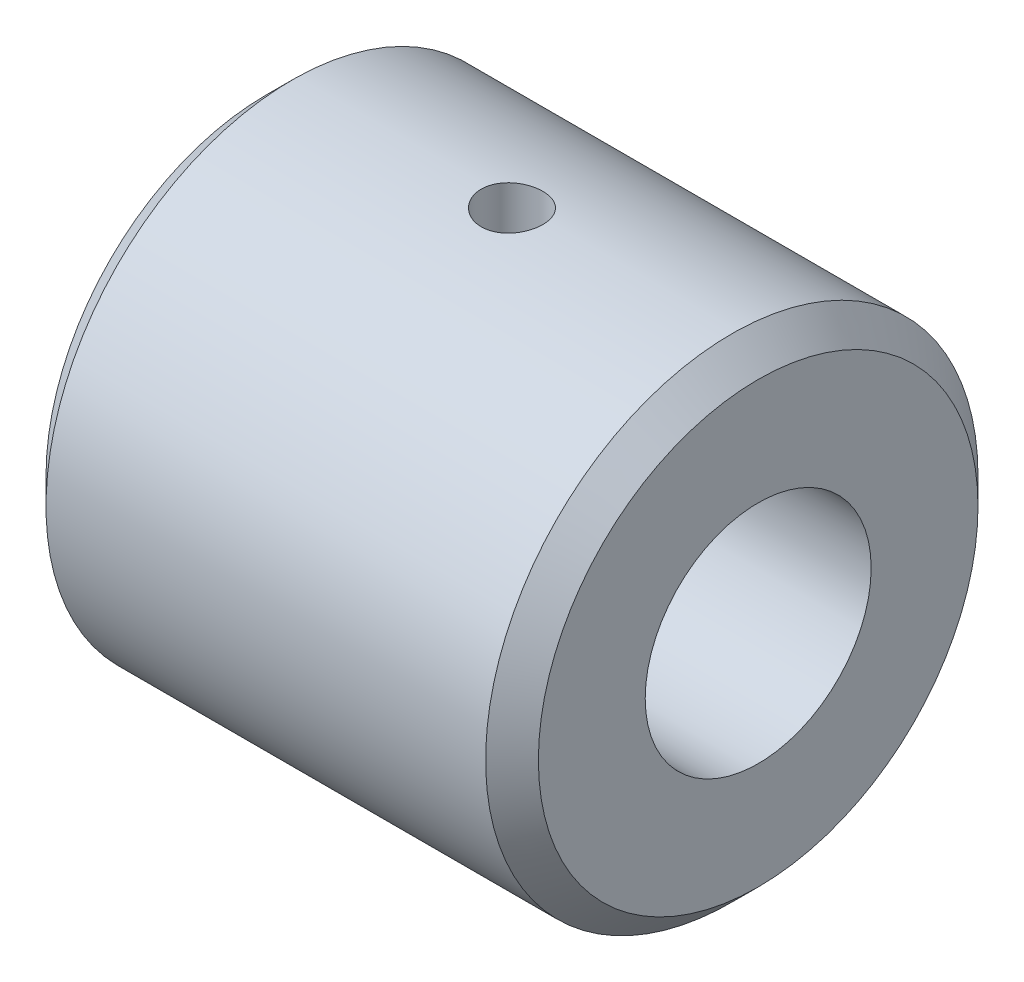
ISO-10303-21;
HEADER;
FILE_DESCRIPTION(('STEP AP214'),'2;1');
FILE_NAME('part.step','',(''),(''),'','','');
FILE_SCHEMA(('AUTOMOTIVE_DESIGN { 1 0 10303 214 1 1 1 1 }'));
ENDSEC;
DATA;
#1=APPLICATION_CONTEXT('core data for automotive mechanical design processes');
#2=APPLICATION_PROTOCOL_DEFINITION('international standard','automotive_design',2000,#1);
#3=PRODUCT_CONTEXT('',#1,'mechanical');
#4=PRODUCT('Part','Part','',(#3));
#5=PRODUCT_RELATED_PRODUCT_CATEGORY('part','',(#4));
#6=PRODUCT_DEFINITION_FORMATION('','',#4);
#7=PRODUCT_DEFINITION_CONTEXT('part definition',#1,'design');
#8=PRODUCT_DEFINITION('design','',#6,#7);
#9=PRODUCT_DEFINITION_SHAPE('','',#8);
#10=(LENGTH_UNIT() NAMED_UNIT(*) SI_UNIT(.MILLI.,.METRE.));
#11=(NAMED_UNIT(*) PLANE_ANGLE_UNIT() SI_UNIT($,.RADIAN.));
#12=(NAMED_UNIT(*) SI_UNIT($,.STERADIAN.) SOLID_ANGLE_UNIT());
#13=UNCERTAINTY_MEASURE_WITH_UNIT(LENGTH_MEASURE(1.E-05),#10,'distance_accuracy_value','');
#14=(GEOMETRIC_REPRESENTATION_CONTEXT(3) GLOBAL_UNCERTAINTY_ASSIGNED_CONTEXT((#13)) GLOBAL_UNIT_ASSIGNED_CONTEXT((#10,
#11,#12)) REPRESENTATION_CONTEXT('',''));
#15=CARTESIAN_POINT('',(0.,0.,0.));
#16=DIRECTION('',(0.,0.,1.));
#17=DIRECTION('',(1.,0.,0.));
#18=AXIS2_PLACEMENT_3D('',#15,#16,#17);
#19=CARTESIAN_POINT('',(3.556,0.,0.));
#20=DIRECTION('',(-1.,0.,0.));
#21=DIRECTION('',(0.,0.,1.));
#22=AXIS2_PLACEMENT_3D('',#19,#20,#21);
#23=CYLINDRICAL_SURFACE('',#22,3.556);
#24=CARTESIAN_POINT('',(-0.444499999999994,-3.556,0.));
#25=CARTESIAN_POINT('',(-0.444498943701623,-3.55599965310585,0.024863746789814));
#26=CARTESIAN_POINT('',(-0.442406782083695,-3.55573647293861,0.0497430303110277));
#27=CARTESIAN_POINT('',(-0.434093765237306,-3.554711910318,0.0988092922115566));
#28=CARTESIAN_POINT('',(-0.427868599037215,-3.55395000767886,0.1229955201849));
#29=CARTESIAN_POINT('',(-0.41147584691207,-3.55201383253695,0.169958233201759));
#30=CARTESIAN_POINT('',(-0.401310914606202,-3.55083983764795,0.19273565519398));
#31=CARTESIAN_POINT('',(-0.377332976910165,-3.54821005016126,0.236256990635978));
#32=CARTESIAN_POINT('',(-0.363520597323233,-3.54675430591556,0.257001252084719));
#33=CARTESIAN_POINT('',(-0.332558551318516,-3.54371459128265,0.295985938850384));
#34=CARTESIAN_POINT('',(-0.315392818402234,-3.54213002592312,0.314213558885816));
#35=CARTESIAN_POINT('',(-0.278245829975181,-3.53901605684534,0.347537266694517));
#36=CARTESIAN_POINT('',(-0.258264431034421,-3.53748665594215,0.362633194842537));
#37=CARTESIAN_POINT('',(-0.215970107988822,-3.53465031939162,0.389312686676279));
#38=CARTESIAN_POINT('',(-0.193649561113217,-3.53334415002233,0.400884254658317));
#39=CARTESIAN_POINT('',(-0.147362942163757,-3.53111000639776,0.42010994301505));
#40=CARTESIAN_POINT('',(-0.123396932529259,-3.53018201780116,0.427764211943989));
#41=CARTESIAN_POINT('',(-0.0746325820246721,-3.52881498381523,0.438899118648397));
#42=CARTESIAN_POINT('',(-0.0498392499801937,-3.52837340655053,0.44240137587929));
#43=CARTESIAN_POINT('',(-1.31103547080831E-05,-3.52802144203788,0.445199740711269));
#44=CARTESIAN_POINT('',(0.0250196875556231,-3.52811103342868,0.444496017458223));
#45=CARTESIAN_POINT('',(0.0744634982848323,-3.52880896664742,0.438920144640431));
#46=CARTESIAN_POINT('',(0.0988772445464053,-3.52941434469346,0.434071810058673));
#47=CARTESIAN_POINT('',(0.146541874772734,-3.53107101716906,0.420381498129763));
#48=CARTESIAN_POINT('',(0.169792735166154,-3.5321223206333,0.411539439867482));
#49=CARTESIAN_POINT('',(0.214545570226053,-3.53455574800735,0.390087076552286));
#50=CARTESIAN_POINT('',(0.236042532784266,-3.53593877836995,0.377466422509212));
#51=CARTESIAN_POINT('',(0.276622430266671,-3.5388791249236,0.348822525269435));
#52=CARTESIAN_POINT('',(0.295705254710116,-3.54043644908491,0.332799126439157));
#53=CARTESIAN_POINT('',(0.331053413966499,-3.54356308538518,0.297672601892018));
#54=CARTESIAN_POINT('',(0.347298356515986,-3.54513240596389,0.27854894899395));
#55=CARTESIAN_POINT('',(0.376350838869426,-3.54809613668431,0.237835444668452));
#56=CARTESIAN_POINT('',(0.389158370747076,-3.54949054642268,0.216245587554382));
#57=CARTESIAN_POINT('',(0.410972488778478,-3.55194820864463,0.171196805168424));
#58=CARTESIAN_POINT('',(0.419977798020076,-3.55301134984593,0.147737255131044));
#59=CARTESIAN_POINT('',(0.433915653748428,-3.55468567711695,0.0996227518086404));
#60=CARTESIAN_POINT('',(0.438848390905961,-3.5552968843453,0.0749678545449316));
#61=CARTESIAN_POINT('',(0.44447465003352,-3.55599572641833,0.0253388405438195));
#62=CARTESIAN_POINT('',(0.445196263442325,-3.5560868306616,0.000367955357312362));
#63=CARTESIAN_POINT('',(0.442453924884846,-3.55574456897365,-0.049338795289254));
#64=CARTESIAN_POINT('',(0.438990062054661,-3.55531121421158,-0.0740746657430037));
#65=CARTESIAN_POINT('',(0.427998433779908,-3.5539708908494,-0.122526337472885));
#66=CARTESIAN_POINT('',(0.420484062667006,-3.55306548356706,-0.14624522422151));
#67=CARTESIAN_POINT('',(0.401618649049877,-3.55088242367215,-0.192086168633822));
#68=CARTESIAN_POINT('',(0.390267476272219,-3.54960475842027,-0.21420817204653));
#69=CARTESIAN_POINT('',(0.363982712151169,-3.54681098113418,-0.256352843778221));
#70=CARTESIAN_POINT('',(0.349030949672553,-3.54529367350758,-0.276364098518007));
#71=CARTESIAN_POINT('',(0.315995139338414,-3.54219408305502,-0.313603104755555));
#72=CARTESIAN_POINT('',(0.29791096714977,-3.54061179765183,-0.330830745712289));
#73=CARTESIAN_POINT('',(0.258999941300577,-3.53754988151247,-0.362113162277838));
#74=CARTESIAN_POINT('',(0.238158060026009,-3.53607088645452,-0.376149316888973));
#75=CARTESIAN_POINT('',(0.19439616406483,-3.53339346082405,-0.400521683743049));
#76=CARTESIAN_POINT('',(0.171476191049073,-3.53219502462737,-0.410857970156898));
#77=CARTESIAN_POINT('',(0.124268808255553,-3.53021873399875,-0.427507045722465));
#78=CARTESIAN_POINT('',(0.0999851490174692,-3.52943978293855,-0.433830333561868));
#79=CARTESIAN_POINT('',(0.0506903383837968,-3.52838751048345,-0.442307724909697));
#80=CARTESIAN_POINT('',(0.0256792208864892,-3.52811416556641,-0.444462022370852));
#81=CARTESIAN_POINT('',(-0.0241752756125915,-3.52810473927481,-0.444536722115878));
#82=CARTESIAN_POINT('',(-0.049018615153409,-3.52836494560897,-0.442486379030925));
#83=CARTESIAN_POINT('',(-0.0980046275975534,-3.52938532164714,-0.434271949182204));
#84=CARTESIAN_POINT('',(-0.122147300425802,-3.53014549140472,-0.42810786197764));
#85=CARTESIAN_POINT('',(-0.169042808913063,-3.53207899384715,-0.411850065702015));
#86=CARTESIAN_POINT('',(-0.191796139524876,-3.53325217837597,-0.401757765616626));
#87=CARTESIAN_POINT('',(-0.235291035089787,-3.53587976660929,-0.37793290720232));
#88=CARTESIAN_POINT('',(-0.256032574830922,-3.53733417383741,-0.3642003032608));
#89=CARTESIAN_POINT('',(-0.295064651865532,-3.54037245524947,-0.333376125699061));
#90=CARTESIAN_POINT('',(-0.313337910957791,-3.54195712856541,-0.316262750262783));
#91=CARTESIAN_POINT('',(-0.346764553514861,-3.54507033457218,-0.279208270354974));
#92=CARTESIAN_POINT('',(-0.361917200355668,-3.546598853938,-0.259266500109367));
#93=CARTESIAN_POINT('',(-0.388721536493316,-3.54943394661123,-0.217034347387875));
#94=CARTESIAN_POINT('',(-0.400359693088882,-3.55073965378922,-0.194735321912196));
#95=CARTESIAN_POINT('',(-0.419709566990509,-3.55297322005842,-0.148495520029165));
#96=CARTESIAN_POINT('',(-0.427425550645639,-3.5539014894871,-0.124556559778726));
#97=CARTESIAN_POINT('',(-0.436865150326852,-3.55505182874273,-0.0837448262558958));
#98=CARTESIAN_POINT('',(-0.439724103884405,-3.55540566064212,-0.0671293969733075));
#99=CARTESIAN_POINT('',(-0.443541879484249,-3.5558798629033,-0.0336783538391704));
#100=CARTESIAN_POINT('',(-0.44450071553819,-3.55600023498665,-0.0168427416121934));
#101=CARTESIAN_POINT('',(-0.444499999999994,-3.556,0.));
#102=B_SPLINE_CURVE_WITH_KNOTS('',3,(#24,#25,#26,#27,#28,#29,#30,#31,#32,#33,#34,#35,#36,#37,
#38,#39,#40,#41,#42,#43,#44,#45,#46,#47,#48,#49,#50,#51,#52,#53,#54,#55,#56,#57,#58,#59,#60,#61,
#62,#63,#64,#65,#66,#67,#68,#69,#70,#71,#72,#73,#74,#75,#76,#77,#78,#79,#80,#81,#82,#83,#84,#85,
#86,#87,#88,#89,#90,#91,#92,#93,#94,#95,#96,#97,#98,#99,#100,#101),.UNSPECIFIED.,.T.,.F.,(4,2,2,
2,2,2,2,2,2,2,2,2,2,2,2,2,2,2,2,2,2,2,2,2,2,2,2,2,2,2,2,2,2,2,2,2,2,2,4),(0.,0.0745297190996156,
0.149137299555739,0.223694715354715,0.298239347420924,0.373150305872871,0.448065081668412,
0.523232063066942,0.598396193725314,0.673167202559069,0.747935204454921,0.822276454273317,
0.896619210355564,0.971167471935664,1.04571914391323,1.12078626412653,1.1958535574351,
1.27094604081078,1.3460350082869,1.42062249675882,1.49520839680441,1.56954915382244,
1.64389243523435,1.71861907240671,1.79334867634488,1.86850370534044,1.94365722762587,
2.01861331607146,2.09356591727286,2.16799879033751,2.2424316713778,2.3168378791281,
2.39124501922397,2.46614865261604,2.54106994687965,2.61627615459949,2.69140038066017,
2.74188730318756,2.79237385341814),.UNSPECIFIED.);
#103=CARTESIAN_POINT('',(-0.444499999999994,-3.556,0.));
#104=VERTEX_POINT('',#103);
#105=EDGE_CURVE('E10',#104,#104,#102,.T.);
#106=ORIENTED_EDGE('',*,*,#105,.T.);
#107=EDGE_LOOP('',(#106));
#108=FACE_BOUND('',#107,.T.);
#109=CARTESIAN_POINT('',(0.,3.52810937330463,0.444499999999994));
#110=CARTESIAN_POINT('',(-0.0248628912581869,3.52810973045662,0.44449894294947));
#111=CARTESIAN_POINT('',(-0.0497413217600754,3.52837502752148,0.442406920445978));
#112=CARTESIAN_POINT('',(-0.098805811476938,3.52940714916239,0.434094506359648));
#113=CARTESIAN_POINT('',(-0.122991119612372,3.53017449780319,0.427869800790026));
#114=CARTESIAN_POINT('',(-0.169951887040228,3.53212248017271,0.41147839598445));
#115=CARTESIAN_POINT('',(-0.192728291068695,3.53330283334859,0.401314372213121));
#116=CARTESIAN_POINT('',(-0.23624791873414,3.5359434906184,0.377338574480765));
#117=CARTESIAN_POINT('',(-0.256991489119912,3.53740374684206,0.363527424115233));
#118=CARTESIAN_POINT('',(-0.29597694753831,3.54044882833566,0.332566623457009));
#119=CARTESIAN_POINT('',(-0.314205813452293,3.54203423974623,0.315400631711315));
#120=CARTESIAN_POINT('',(-0.347531928317362,3.54514572405323,0.27825260134734));
#121=CARTESIAN_POINT('',(-0.362629021468031,3.54667179399444,0.258270422711515));
#122=CARTESIAN_POINT('',(-0.389309738436226,3.5494986445216,0.215975407894185));
#123=CARTESIAN_POINT('',(-0.400881578618714,3.55079866341962,0.193655083070763));
#124=CARTESIAN_POINT('',(-0.420107831349498,3.55302049330515,0.14736894647034));
#125=CARTESIAN_POINT('',(-0.427762389291529,3.55394231832944,0.123403195802367));
#126=CARTESIAN_POINT('',(-0.438897889749855,3.55529976795967,0.0746396732821466));
#127=CARTESIAN_POINT('',(-0.442400480441542,3.5557379136183,0.0498469162481477));
#128=CARTESIAN_POINT('',(-0.44519971145949,3.55608724597855,2.1905082067834E-05));
#129=CARTESIAN_POINT('',(-0.444496517245155,3.5559984534104,-0.0250103395896701));
#130=CARTESIAN_POINT('',(-0.438921488949723,3.55530595373508,-0.0744564648236737));
#131=CARTESIAN_POINT('',(-0.434072937050005,3.55470512252628,-0.0988730163849185));
#132=CARTESIAN_POINT('',(-0.420381220795192,3.55305928746547,-0.146543144742374));
#133=CARTESIAN_POINT('',(-0.411537980499532,3.55201427516941,-0.169796699420231));
#134=CARTESIAN_POINT('',(-0.390083155583038,3.54959254638247,-0.214552827384987));
#135=CARTESIAN_POINT('',(-0.377461495415568,3.54821494493328,-0.236050520910041));
#136=CARTESIAN_POINT('',(-0.348815443197985,3.54528216099807,-0.276631455020088));
#137=CARTESIAN_POINT('',(-0.332790895090483,3.54372697036928,-0.295714584808442));
#138=CARTESIAN_POINT('',(-0.297663546653203,3.54060050645681,-0.331061471871425));
#139=CARTESIAN_POINT('',(-0.278540455952599,3.53902919590081,-0.347305068151283));
#140=CARTESIAN_POINT('',(-0.237828559204076,3.53605807991035,-0.376355100841139));
#141=CARTESIAN_POINT('',(-0.21623974542753,3.5346582750135,-0.389161526477155));
#142=CARTESIAN_POINT('',(-0.171191263689016,3.53218867304541,-0.410974845183005));
#143=CARTESIAN_POINT('',(-0.147730805384319,3.53111901632466,-0.419980122929516));
#144=CARTESIAN_POINT('',(-0.0996143251629278,3.52943355515781,-0.43391763816442));
#145=CARTESIAN_POINT('',(-0.0749583609247082,3.52881772883936,-0.438850071944966));
#146=CARTESIAN_POINT('',(-0.0253288222404413,3.52811365025804,-0.444475184793345));
#147=CARTESIAN_POINT('',(-0.000358511814812326,3.52802186751255,-0.445196236707289));
#148=CARTESIAN_POINT('',(0.0493469550945101,3.52836693051074,-0.442452980284387));
#149=CARTESIAN_POINT('',(0.0740821165790616,3.52880376498698,-0.438988761156318));
#150=CARTESIAN_POINT('',(0.122530116764143,3.53015362024453,-0.42799718821483));
#151=CARTESIAN_POINT('',(0.146246121180852,3.53106503053111,-0.420483573210043));
#152=CARTESIAN_POINT('',(0.192081634732889,3.5332600378081,-0.401620635258842));
#153=CARTESIAN_POINT('',(0.214201087743424,3.53454364787478,-0.390271177547736));
#154=CARTESIAN_POINT('',(0.256343975669947,3.53734687994605,-0.36398896353914));
#155=CARTESIAN_POINT('',(0.276355725092901,3.53886771248653,-0.349037601060804));
#156=CARTESIAN_POINT('',(0.313595915289644,3.54197022792172,-0.316002293993196));
#157=CARTESIAN_POINT('',(0.330824247750123,3.54355191318147,-0.297918227555247));
#158=CARTESIAN_POINT('',(0.362108224508052,3.54660876168541,-0.259006909694302));
#159=CARTESIAN_POINT('',(0.376145225040145,3.54808326637646,-0.238164609898405));
#160=CARTESIAN_POINT('',(0.400519075095283,3.5507497669702,-0.194401645023019));
#161=CARTESIAN_POINT('',(0.410855999199911,3.55194176856708,-0.171481021847485));
#162=CARTESIAN_POINT('',(0.427505482512242,3.55390603278137,-0.124273996154993));
#163=CARTESIAN_POINT('',(0.433828816674414,3.55467941839274,-0.0999914425257924));
#164=CARTESIAN_POINT('',(0.442306675064511,3.55572397381671,-0.0506989689840201));
#165=CARTESIAN_POINT('',(0.444461387280538,3.55599516627618,-0.0256890819228947));
#166=CARTESIAN_POINT('',(0.444537324183539,3.5560046726083,0.0241660751985248));
#167=CARTESIAN_POINT('',(0.442487296988979,3.55574660507242,0.0490113056856793));
#168=CARTESIAN_POINT('',(0.434272834931992,3.55473378157881,0.0980011804302734));
#169=CARTESIAN_POINT('',(0.428108402931023,3.55397902596652,0.12214582517494));
#170=CARTESIAN_POINT('',(0.411849143268618,3.55205725870699,0.169045384563143));
#171=CARTESIAN_POINT('',(0.401755692407435,3.55089039148449,0.19180078279637));
#172=CARTESIAN_POINT('',(0.377927890262771,3.54827360784397,0.235299335344205));
#173=CARTESIAN_POINT('',(0.364193495695066,3.54682368806103,0.256042465732588));
#174=CARTESIAN_POINT('',(0.333367316313186,3.54379081879968,0.295074527343739));
#175=CARTESIAN_POINT('',(0.31625414131149,3.54220706059392,0.313346503476934));
#176=CARTESIAN_POINT('',(0.279200594551664,3.53909150272608,0.346770650926075));
#177=CARTESIAN_POINT('',(0.259259554062113,3.53755971546052,0.361922082213677));
#178=CARTESIAN_POINT('',(0.217028027744405,3.53471522665975,0.388725072119346));
#179=CARTESIAN_POINT('',(0.194728766509538,3.53340339400356,0.40036288944704));
#180=CARTESIAN_POINT('',(0.148488471522249,3.53115753173669,0.419712064267442));
#181=CARTESIAN_POINT('',(0.124549255723854,3.53022309145159,0.427427692224388));
#182=CARTESIAN_POINT('',(0.0837384683036582,3.52906469896568,0.436866316351106));
#183=CARTESIAN_POINT('',(0.0671243092166182,3.52870823610595,0.439724830913675));
#184=CARTESIAN_POINT('',(0.0336758089558797,3.52823045320478,0.443542023539993));
#185=CARTESIAN_POINT('',(0.0168414694537302,3.52810913137926,0.444500716018253));
#186=CARTESIAN_POINT('',(0.,3.52810937330463,0.444499999999994));
#187=B_SPLINE_CURVE_WITH_KNOTS('',3,(#109,#110,#111,#112,#113,#114,#115,#116,#117,#118,#119,
#120,#121,#122,#123,#124,#125,#126,#127,#128,#129,#130,#131,#132,#133,#134,#135,#136,#137,#138,
#139,#140,#141,#142,#143,#144,#145,#146,#147,#148,#149,#150,#151,#152,#153,#154,#155,#156,#157,
#158,#159,#160,#161,#162,#163,#164,#165,#166,#167,#168,#169,#170,#171,#172,#173,#174,#175,#176,
#177,#178,#179,#180,#181,#182,#183,#184,#185,#186),.UNSPECIFIED.,.T.,.F.,(4,2,2,2,2,2,2,2,2,2,2,
2,2,2,2,2,2,2,2,2,2,2,2,2,2,2,2,2,2,2,2,2,2,2,2,2,2,2,4),(0.,0.0745271489478076,
0.149132217179891,0.223686704468934,0.298228452476185,0.373142774882234,0.448060823256299,
0.52322661496712,0.59838961662421,0.673158973361902,0.747925388624442,0.822274620250931,
0.896625265344429,0.971175967445952,1.04573008920205,1.12079376593766,1.19585767796132,
1.27095345686194,1.34604561628368,1.42063127725884,1.49521534847359,1.56954794904846,
1.64388316142265,1.71861092314941,1.79334159211675,1.86849821911656,1.94365333111636,
2.0186058173636,2.09355492347603,2.16799330536049,2.24243163547508,2.31684390448136,
2.3912570581544,2.46615734916787,2.54107538217198,2.61628272371916,2.69140800347599,
2.74189111956734,2.79237385262699),.UNSPECIFIED.);
#188=CARTESIAN_POINT('',(0.,3.52810937330463,0.444499999999994));
#189=VERTEX_POINT('',#188);
#190=EDGE_CURVE('E43',#189,#189,#187,.T.);
#191=ORIENTED_EDGE('',*,*,#190,.T.);
#192=EDGE_LOOP('',(#191));
#193=FACE_BOUND('',#192,.T.);
#194=CARTESIAN_POINT('',(-3.175,0.,0.));
#195=DIRECTION('',(1.,0.,0.));
#196=DIRECTION('',(0.,0.,-1.));
#197=AXIS2_PLACEMENT_3D('',#194,#195,#196);
#198=CIRCLE('',#197,3.556);
#199=CARTESIAN_POINT('',(-3.175,0.,-3.556));
#200=VERTEX_POINT('',#199);
#201=EDGE_CURVE('E90',#200,#200,#198,.T.);
#202=ORIENTED_EDGE('',*,*,#201,.T.);
#203=EDGE_LOOP('',(#202));
#204=FACE_BOUND('',#203,.T.);
#205=CARTESIAN_POINT('',(3.17499999999999,0.,0.));
#206=DIRECTION('',(1.,0.,0.));
#207=DIRECTION('',(0.,0.,-1.));
#208=AXIS2_PLACEMENT_3D('',#205,#206,#207);
#209=CIRCLE('',#208,3.556);
#210=CARTESIAN_POINT('',(3.17499999999999,0.,-3.556));
#211=VERTEX_POINT('',#210);
#212=EDGE_CURVE('E87',#211,#211,#209,.F.);
#213=ORIENTED_EDGE('',*,*,#212,.T.);
#214=EDGE_LOOP('',(#213));
#215=FACE_BOUND('',#214,.T.);
#216=ADVANCED_FACE('F32',(#108,#193,#204,#215),#23,.T.);
#217=CARTESIAN_POINT('',(3.556,0.,0.));
#218=DIRECTION('',(1.,0.,0.));
#219=DIRECTION('',(0.,0.,-1.));
#220=AXIS2_PLACEMENT_3D('',#217,#218,#219);
#221=PLANE('',#220);
#222=CARTESIAN_POINT('',(3.556,0.,0.));
#223=DIRECTION('',(1.,0.,0.));
#224=DIRECTION('',(0.,0.,-1.));
#225=AXIS2_PLACEMENT_3D('',#222,#223,#224);
#226=CIRCLE('',#225,3.175);
#227=CARTESIAN_POINT('',(3.556,0.,-3.175));
#228=VERTEX_POINT('',#227);
#229=EDGE_CURVE('E47',#228,#228,#226,.T.);
#230=ORIENTED_EDGE('',*,*,#229,.T.);
#231=EDGE_LOOP('',(#230));
#232=FACE_BOUND('',#231,.T.);
#233=CARTESIAN_POINT('',(3.556,0.,0.));
#234=DIRECTION('',(1.,0.,0.));
#235=DIRECTION('',(0.,0.,-1.));
#236=AXIS2_PLACEMENT_3D('',#233,#234,#235);
#237=CIRCLE('',#236,1.63194999999999);
#238=CARTESIAN_POINT('',(3.556,0.,-1.63194999999999));
#239=VERTEX_POINT('',#238);
#240=EDGE_CURVE('E81',#239,#239,#237,.T.);
#241=ORIENTED_EDGE('',*,*,#240,.F.);
#242=EDGE_LOOP('',(#241));
#243=FACE_BOUND('',#242,.T.);
#244=ADVANCED_FACE('F105',(#232,#243),#221,.T.);
#245=CARTESIAN_POINT('',(-3.556,0.,0.));
#246=DIRECTION('',(1.,0.,0.));
#247=DIRECTION('',(0.,0.,-1.));
#248=AXIS2_PLACEMENT_3D('',#245,#246,#247);
#249=PLANE('',#248);
#250=CARTESIAN_POINT('',(-3.556,0.,0.));
#251=DIRECTION('',(1.,0.,0.));
#252=DIRECTION('',(0.,0.,-1.));
#253=AXIS2_PLACEMENT_3D('',#250,#251,#252);
#254=CIRCLE('',#253,3.175);
#255=CARTESIAN_POINT('',(-3.556,0.,-3.175));
#256=VERTEX_POINT('',#255);
#257=EDGE_CURVE('E51',#256,#256,#254,.F.);
#258=ORIENTED_EDGE('',*,*,#257,.T.);
#259=EDGE_LOOP('',(#258));
#260=FACE_BOUND('',#259,.T.);
#261=CARTESIAN_POINT('',(-3.556,0.,0.));
#262=DIRECTION('',(1.,0.,0.));
#263=DIRECTION('',(0.,0.,-1.));
#264=AXIS2_PLACEMENT_3D('',#261,#262,#263);
#265=CIRCLE('',#264,1.63195);
#266=CARTESIAN_POINT('',(-3.556,0.,-1.63195));
#267=VERTEX_POINT('',#266);
#268=EDGE_CURVE('E84',#267,#267,#265,.T.);
#269=ORIENTED_EDGE('',*,*,#268,.T.);
#270=EDGE_LOOP('',(#269));
#271=FACE_BOUND('',#270,.T.);
#272=ADVANCED_FACE('F95',(#260,#271),#249,.F.);
#273=CARTESIAN_POINT('',(3.556,0.,0.));
#274=DIRECTION('',(1.,0.,0.));
#275=DIRECTION('',(0.,0.,-1.));
#276=AXIS2_PLACEMENT_3D('',#273,#274,#275);
#277=CYLINDRICAL_SURFACE('',#276,1.63194999999999);
#278=CARTESIAN_POINT('',(0.,-1.57024856392228,0.444499999999994));
#279=CARTESIAN_POINT('',(-0.0244655486680404,-1.57024896761119,0.4444994511752));
#280=CARTESIAN_POINT('',(-0.0489368222731073,-1.57082660167213,0.442473221497674));
#281=CARTESIAN_POINT('',(-0.0971712118069247,-1.57306744426091,0.43443808694743));
#282=CARTESIAN_POINT('',(-0.120933986813033,-1.57473116686195,0.428427296060242));
#283=CARTESIAN_POINT('',(-0.167046583091132,-1.57894209129914,0.412636430668242));
#284=CARTESIAN_POINT('',(-0.189398395383301,-1.58148801374801,0.402861812284804));
#285=CARTESIAN_POINT('',(-0.232148757523098,-1.58717482916717,0.37983800113222));
#286=CARTESIAN_POINT('',(-0.252547131514159,-1.59031577562832,0.366588495940104));
#287=CARTESIAN_POINT('',(-0.291343790613951,-1.59693057831653,0.33662128001108));
#288=CARTESIAN_POINT('',(-0.309683561442686,-1.60041053878397,0.319829145991292));
#289=CARTESIAN_POINT('',(-0.343324510252841,-1.60725866979316,0.283413308017359));
#290=CARTESIAN_POINT('',(-0.358625361614752,-1.6106268282862,0.263789300087654));
#291=CARTESIAN_POINT('',(-0.385999780470514,-1.61694017270628,0.221859301526471));
#292=CARTESIAN_POINT('',(-0.398014931523971,-1.61987731932314,0.199513857405477));
#293=CARTESIAN_POINT('',(-0.418095498665248,-1.62492751989408,0.153026588278411));
#294=CARTESIAN_POINT('',(-0.426161610732378,-1.62704071904742,0.128885080675448));
#295=CARTESIAN_POINT('',(-0.437925058910337,-1.63016175732195,0.0801019865568294));
#296=CARTESIAN_POINT('',(-0.441721989491594,-1.63119475405499,0.055486053911963));
#297=CARTESIAN_POINT('',(-0.44515289357551,-1.63212706095032,0.00594636313450575));
#298=CARTESIAN_POINT('',(-0.444787592810456,-1.63202656874932,-0.0189773405776905));
#299=CARTESIAN_POINT('',(-0.43997400361612,-1.63072154774633,-0.0677309733728401));
#300=CARTESIAN_POINT('',(-0.435633356935288,-1.6295461263736,-0.0915724289077896));
#301=CARTESIAN_POINT('',(-0.423166504970715,-1.62625783162221,-0.138174817441793));
#302=CARTESIAN_POINT('',(-0.415040079268491,-1.62414490365969,-0.160935687441144));
#303=CARTESIAN_POINT('',(-0.3951514526094,-1.6191763148463,-0.205002482958443));
#304=CARTESIAN_POINT('',(-0.38335287255183,-1.61631326978988,-0.226291122707641));
#305=CARTESIAN_POINT('',(-0.356482905772445,-1.61015216302074,-0.266622684377154));
#306=CARTESIAN_POINT('',(-0.341410857423444,-1.6068540134185,-0.285665151102845));
#307=CARTESIAN_POINT('',(-0.307852462226814,-1.60005490890749,-0.32160639820976));
#308=CARTESIAN_POINT('',(-0.289272315066151,-1.59655084145515,-0.338417113341175));
#309=CARTESIAN_POINT('',(-0.249520577183734,-1.58982954872758,-0.368706086153563));
#310=CARTESIAN_POINT('',(-0.228348814139995,-1.58661234255098,-0.382184122057548));
#311=CARTESIAN_POINT('',(-0.183817285441488,-1.58081612448897,-0.405496099608507));
#312=CARTESIAN_POINT('',(-0.16044385953295,-1.57824151541517,-0.415305119098398));
#313=CARTESIAN_POINT('',(-0.112291816992101,-1.57407619711347,-0.430825042844965));
#314=CARTESIAN_POINT('',(-0.0875135680777162,-1.57248523169918,-0.436537014224928));
#315=CARTESIAN_POINT('',(-0.0380812717914111,-1.57052219166822,-0.443546818969226));
#316=CARTESIAN_POINT('',(-0.0134473359192738,-1.57011374170907,-0.444976431401358));
#317=CARTESIAN_POINT('',(0.0357078021914713,-1.57046227898129,-0.443744825051804));
#318=CARTESIAN_POINT('',(0.0602290167143029,-1.57121913604677,-0.441084063168826));
#319=CARTESIAN_POINT('',(0.107948210177135,-1.57377777724272,-0.431863620081627));
#320=CARTESIAN_POINT('',(0.131162935822996,-1.57555807030753,-0.42538406105385));
#321=CARTESIAN_POINT('',(0.176175841807998,-1.57994178467349,-0.408800496354727));
#322=CARTESIAN_POINT('',(0.197973830846012,-1.58254531685891,-0.398696002406531));
#323=CARTESIAN_POINT('',(0.24008332847731,-1.58835613798764,-0.37488477836395));
#324=CARTESIAN_POINT('',(0.260349609065687,-1.59157584010032,-0.361101163946666));
#325=CARTESIAN_POINT('',(0.298329903179184,-1.5982274465012,-0.330417601296624));
#326=CARTESIAN_POINT('',(0.316043414191574,-1.60165939238008,-0.313517040981651));
#327=CARTESIAN_POINT('',(0.348967135330929,-1.60847471366,-0.276468133257124));
#328=CARTESIAN_POINT('',(0.364085191570584,-1.61185346357971,-0.256236868478748));
#329=CARTESIAN_POINT('',(0.390711118671058,-1.61807527868787,-0.213447632076891));
#330=CARTESIAN_POINT('',(0.402219181623785,-1.62091837237598,-0.190889784338479));
#331=CARTESIAN_POINT('',(0.421191271959006,-1.62573020517736,-0.144246404202682));
#332=CARTESIAN_POINT('',(0.428685714464771,-1.62770549931025,-0.120173952244537));
#333=CARTESIAN_POINT('',(0.439504761136571,-1.63058805901122,-0.0710492111795481));
#334=CARTESIAN_POINT('',(0.442830332503523,-1.63149557230729,-0.0459971507385985));
#335=CARTESIAN_POINT('',(0.445154475068907,-1.63212806052767,0.00351634624989146));
#336=CARTESIAN_POINT('',(0.44428795185196,-1.63188990555951,0.0279710670863168));
#337=CARTESIAN_POINT('',(0.438567253252033,-1.63034177278467,0.0763730119245514));
#338=CARTESIAN_POINT('',(0.433713239296035,-1.62903183836723,0.100320256430445));
#339=CARTESIAN_POINT('',(0.420232925999615,-1.6254952018095,0.146857770207184));
#340=CARTESIAN_POINT('',(0.411635043690093,-1.62327541303192,0.169456831279397));
#341=CARTESIAN_POINT('',(0.390936365304007,-1.61815067385439,0.212904429218985));
#342=CARTESIAN_POINT('',(0.378835061957009,-1.61524562424485,0.233752712021776));
#343=CARTESIAN_POINT('',(0.351084106588256,-1.60896033849896,0.273730732011342));
#344=CARTESIAN_POINT('',(0.335345773775706,-1.60556920402844,0.292797191155242));
#345=CARTESIAN_POINT('',(0.300934294871744,-1.59873642060337,0.328064044814045));
#346=CARTESIAN_POINT('',(0.282260366495553,-1.59529475840634,0.344263672915632));
#347=CARTESIAN_POINT('',(0.241986270869547,-1.5886582198048,0.373710413028319));
#348=CARTESIAN_POINT('',(0.220328224302978,-1.58547092948921,0.386880232492587));
#349=CARTESIAN_POINT('',(0.175021174094749,-1.57981315846655,0.409373404299826));
#350=CARTESIAN_POINT('',(0.151373430047439,-1.57734222860161,0.418699168418785));
#351=CARTESIAN_POINT('',(0.106525533480674,-1.57372430681523,0.432079495457538));
#352=CARTESIAN_POINT('',(0.0855119207417101,-1.5724317233982,0.436725956373948));
#353=CARTESIAN_POINT('',(0.043000305205206,-1.57069372783061,0.442936255962307));
#354=CARTESIAN_POINT('',(0.0215023636762304,-1.57024820912681,0.444500482352974));
#355=CARTESIAN_POINT('',(0.,-1.57024856392228,0.444499999999994));
#356=B_SPLINE_CURVE_WITH_KNOTS('',3,(#278,#279,#280,#281,#282,#283,#284,#285,#286,#287,#288,
#289,#290,#291,#292,#293,#294,#295,#296,#297,#298,#299,#300,#301,#302,#303,#304,#305,#306,#307,
#308,#309,#310,#311,#312,#313,#314,#315,#316,#317,#318,#319,#320,#321,#322,#323,#324,#325,#326,
#327,#328,#329,#330,#331,#332,#333,#334,#335,#336,#337,#338,#339,#340,#341,#342,#343,#344,#345,
#346,#347,#348,#349,#350,#351,#352,#353,#354,#355),.UNSPECIFIED.,.T.,.F.,(4,2,2,2,2,2,2,2,2,2,2,
2,2,2,2,2,2,2,2,2,2,2,2,2,2,2,2,2,2,2,2,2,2,2,2,2,2,2,4),(0.,0.0733175393604003,
0.146669806953497,0.219916139488723,0.293169059774196,0.368149539963038,0.443138074610321,
0.519384002331567,0.595616487615814,0.670031070178424,0.744432677912331,0.816877405508762,
0.889326351564057,0.962517193195094,1.03572284180947,1.11127037010768,1.18682292445121,
1.26287973886079,1.33891673619797,1.41258853234546,1.48625209988104,1.55842254648767,
1.63060271806828,1.70442873677439,1.77826926834077,1.85434802003475,1.93042272280361,
2.00591246950222,2.08138469892315,2.15444462427975,2.22750159207161,2.3000134475554,
2.37253580749533,2.44705889472045,2.52160187481219,2.59787575891044,2.67410171535509,
2.73854738810235,2.80298495361802),.UNSPECIFIED.);
#357=CARTESIAN_POINT('',(0.,-1.57024856392228,0.444499999999994));
#358=VERTEX_POINT('',#357);
#359=EDGE_CURVE('E76',#358,#358,#356,.T.);
#360=ORIENTED_EDGE('',*,*,#359,.T.);
#361=EDGE_LOOP('',(#360));
#362=FACE_BOUND('',#361,.T.);
#363=CARTESIAN_POINT('',(0.,1.57024856392228,0.444499999999994));
#364=CARTESIAN_POINT('',(0.0244655486680404,1.57024896761119,0.4444994511752));
#365=CARTESIAN_POINT('',(0.0489368222731073,1.57082660167213,0.442473221497674));
#366=CARTESIAN_POINT('',(0.0971712118069247,1.57306744426091,0.43443808694743));
#367=CARTESIAN_POINT('',(0.120933986813033,1.57473116686195,0.428427296060242));
#368=CARTESIAN_POINT('',(0.167046583091132,1.57894209129914,0.412636430668242));
#369=CARTESIAN_POINT('',(0.189398395383301,1.58148801374801,0.402861812284804));
#370=CARTESIAN_POINT('',(0.232148757523098,1.58717482916717,0.37983800113222));
#371=CARTESIAN_POINT('',(0.252547131514159,1.59031577562832,0.366588495940104));
#372=CARTESIAN_POINT('',(0.291343790613951,1.59693057831653,0.33662128001108));
#373=CARTESIAN_POINT('',(0.309683561442686,1.60041053878397,0.319829145991292));
#374=CARTESIAN_POINT('',(0.343324510252841,1.60725866979316,0.283413308017359));
#375=CARTESIAN_POINT('',(0.358625361614752,1.6106268282862,0.263789300087654));
#376=CARTESIAN_POINT('',(0.385999780470514,1.61694017270628,0.221859301526471));
#377=CARTESIAN_POINT('',(0.398014931523971,1.61987731932314,0.199513857405477));
#378=CARTESIAN_POINT('',(0.418095498665248,1.62492751989408,0.153026588278411));
#379=CARTESIAN_POINT('',(0.426161610732378,1.62704071904742,0.128885080675448));
#380=CARTESIAN_POINT('',(0.437925058910337,1.63016175732195,0.0801019865568294));
#381=CARTESIAN_POINT('',(0.441721989491594,1.63119475405499,0.055486053911963));
#382=CARTESIAN_POINT('',(0.44515289357551,1.63212706095032,0.00594636313450575));
#383=CARTESIAN_POINT('',(0.444787592810456,1.63202656874932,-0.0189773405776905));
#384=CARTESIAN_POINT('',(0.43997400361612,1.63072154774633,-0.0677309733728401));
#385=CARTESIAN_POINT('',(0.435633356935288,1.6295461263736,-0.0915724289077896));
#386=CARTESIAN_POINT('',(0.423166504970715,1.62625783162221,-0.138174817441793));
#387=CARTESIAN_POINT('',(0.415040079268491,1.62414490365969,-0.160935687441144));
#388=CARTESIAN_POINT('',(0.3951514526094,1.6191763148463,-0.205002482958443));
#389=CARTESIAN_POINT('',(0.38335287255183,1.61631326978988,-0.226291122707641));
#390=CARTESIAN_POINT('',(0.356482905772445,1.61015216302074,-0.266622684377154));
#391=CARTESIAN_POINT('',(0.341410857423444,1.6068540134185,-0.285665151102845));
#392=CARTESIAN_POINT('',(0.307852462226814,1.60005490890749,-0.32160639820976));
#393=CARTESIAN_POINT('',(0.289272315066151,1.59655084145515,-0.338417113341175));
#394=CARTESIAN_POINT('',(0.249520577183734,1.58982954872758,-0.368706086153563));
#395=CARTESIAN_POINT('',(0.228348814139995,1.58661234255098,-0.382184122057548));
#396=CARTESIAN_POINT('',(0.183817285441488,1.58081612448897,-0.405496099608507));
#397=CARTESIAN_POINT('',(0.16044385953295,1.57824151541517,-0.415305119098398));
#398=CARTESIAN_POINT('',(0.112291816992101,1.57407619711347,-0.430825042844965));
#399=CARTESIAN_POINT('',(0.0875135680777162,1.57248523169918,-0.436537014224928));
#400=CARTESIAN_POINT('',(0.0380812717914111,1.57052219166822,-0.443546818969226));
#401=CARTESIAN_POINT('',(0.0134473359192738,1.57011374170907,-0.444976431401358));
#402=CARTESIAN_POINT('',(-0.0357078021914713,1.57046227898129,-0.443744825051804));
#403=CARTESIAN_POINT('',(-0.0602290167143029,1.57121913604677,-0.441084063168826));
#404=CARTESIAN_POINT('',(-0.107948210177135,1.57377777724272,-0.431863620081627));
#405=CARTESIAN_POINT('',(-0.131162935822996,1.57555807030753,-0.42538406105385));
#406=CARTESIAN_POINT('',(-0.176175841807998,1.57994178467349,-0.408800496354727));
#407=CARTESIAN_POINT('',(-0.197973830846012,1.58254531685891,-0.398696002406531));
#408=CARTESIAN_POINT('',(-0.24008332847731,1.58835613798764,-0.37488477836395));
#409=CARTESIAN_POINT('',(-0.260349609065687,1.59157584010032,-0.361101163946666));
#410=CARTESIAN_POINT('',(-0.298329903179184,1.5982274465012,-0.330417601296624));
#411=CARTESIAN_POINT('',(-0.316043414191574,1.60165939238008,-0.313517040981651));
#412=CARTESIAN_POINT('',(-0.348967135330929,1.60847471366,-0.276468133257124));
#413=CARTESIAN_POINT('',(-0.364085191570584,1.61185346357971,-0.256236868478748));
#414=CARTESIAN_POINT('',(-0.390711118671058,1.61807527868787,-0.213447632076891));
#415=CARTESIAN_POINT('',(-0.402219181623785,1.62091837237598,-0.190889784338479));
#416=CARTESIAN_POINT('',(-0.421191271959006,1.62573020517736,-0.144246404202682));
#417=CARTESIAN_POINT('',(-0.428685714464771,1.62770549931025,-0.120173952244537));
#418=CARTESIAN_POINT('',(-0.439504761136571,1.63058805901122,-0.0710492111795481));
#419=CARTESIAN_POINT('',(-0.442830332503523,1.63149557230729,-0.0459971507385985));
#420=CARTESIAN_POINT('',(-0.445154475068907,1.63212806052767,0.00351634624989146));
#421=CARTESIAN_POINT('',(-0.44428795185196,1.63188990555951,0.0279710670863168));
#422=CARTESIAN_POINT('',(-0.438567253252033,1.63034177278467,0.0763730119245514));
#423=CARTESIAN_POINT('',(-0.433713239296035,1.62903183836723,0.100320256430445));
#424=CARTESIAN_POINT('',(-0.420232925999615,1.6254952018095,0.146857770207184));
#425=CARTESIAN_POINT('',(-0.411635043690093,1.62327541303192,0.169456831279397));
#426=CARTESIAN_POINT('',(-0.390936365304007,1.61815067385439,0.212904429218985));
#427=CARTESIAN_POINT('',(-0.378835061957009,1.61524562424485,0.233752712021776));
#428=CARTESIAN_POINT('',(-0.351084106588256,1.60896033849896,0.273730732011342));
#429=CARTESIAN_POINT('',(-0.335345773775706,1.60556920402844,0.292797191155242));
#430=CARTESIAN_POINT('',(-0.300934294871744,1.59873642060337,0.328064044814045));
#431=CARTESIAN_POINT('',(-0.282260366495553,1.59529475840634,0.344263672915632));
#432=CARTESIAN_POINT('',(-0.241986270869547,1.5886582198048,0.373710413028319));
#433=CARTESIAN_POINT('',(-0.220328224302978,1.58547092948921,0.386880232492587));
#434=CARTESIAN_POINT('',(-0.175021174094749,1.57981315846655,0.409373404299826));
#435=CARTESIAN_POINT('',(-0.151373430047439,1.57734222860161,0.418699168418785));
#436=CARTESIAN_POINT('',(-0.106525533480674,1.57372430681523,0.432079495457538));
#437=CARTESIAN_POINT('',(-0.0855119207417101,1.5724317233982,0.436725956373948));
#438=CARTESIAN_POINT('',(-0.043000305205206,1.57069372783061,0.442936255962307));
#439=CARTESIAN_POINT('',(-0.0215023636762304,1.57024820912681,0.444500482352974));
#440=CARTESIAN_POINT('',(0.,1.57024856392228,0.444499999999994));
#441=B_SPLINE_CURVE_WITH_KNOTS('',3,(#363,#364,#365,#366,#367,#368,#369,#370,#371,#372,#373,
#374,#375,#376,#377,#378,#379,#380,#381,#382,#383,#384,#385,#386,#387,#388,#389,#390,#391,#392,
#393,#394,#395,#396,#397,#398,#399,#400,#401,#402,#403,#404,#405,#406,#407,#408,#409,#410,#411,
#412,#413,#414,#415,#416,#417,#418,#419,#420,#421,#422,#423,#424,#425,#426,#427,#428,#429,#430,
#431,#432,#433,#434,#435,#436,#437,#438,#439,#440),.UNSPECIFIED.,.T.,.F.,(4,2,2,2,2,2,2,2,2,2,2,
2,2,2,2,2,2,2,2,2,2,2,2,2,2,2,2,2,2,2,2,2,2,2,2,2,2,2,4),(0.,0.0733175393604003,
0.146669806953497,0.219916139488723,0.293169059774196,0.368149539963038,0.443138074610321,
0.519384002331567,0.595616487615814,0.670031070178424,0.744432677912331,0.816877405508762,
0.889326351564057,0.962517193195094,1.03572284180947,1.11127037010768,1.18682292445121,
1.26287973886079,1.33891673619797,1.41258853234546,1.48625209988104,1.55842254648767,
1.63060271806828,1.70442873677439,1.77826926834077,1.85434802003475,1.93042272280361,
2.00591246950222,2.08138469892315,2.15444462427975,2.22750159207161,2.3000134475554,
2.37253580749533,2.44705889472045,2.52160187481219,2.59787575891044,2.67410171535509,
2.73854738810235,2.80298495361802),.UNSPECIFIED.);
#442=CARTESIAN_POINT('',(0.,1.57024856392228,0.444499999999994));
#443=VERTEX_POINT('',#442);
#444=EDGE_CURVE('E72',#443,#443,#441,.T.);
#445=ORIENTED_EDGE('',*,*,#444,.T.);
#446=EDGE_LOOP('',(#445));
#447=FACE_BOUND('',#446,.T.);
#448=ORIENTED_EDGE('',*,*,#268,.F.);
#449=EDGE_LOOP('',(#448));
#450=FACE_BOUND('',#449,.T.);
#451=ORIENTED_EDGE('',*,*,#240,.T.);
#452=EDGE_LOOP('',(#451));
#453=FACE_BOUND('',#452,.T.);
#454=ADVANCED_FACE('F64',(#362,#447,#450,#453),#277,.F.);
#455=CARTESIAN_POINT('',(-3.175,0.,0.));
#456=DIRECTION('',(1.,0.,0.));
#457=DIRECTION('',(0.,0.,-1.));
#458=AXIS2_PLACEMENT_3D('',#455,#456,#457);
#459=CONICAL_SURFACE('',#458,3.556,0.785398163397451);
#460=ORIENTED_EDGE('',*,*,#257,.F.);
#461=EDGE_LOOP('',(#460));
#462=FACE_BOUND('',#461,.T.);
#463=ORIENTED_EDGE('',*,*,#201,.F.);
#464=EDGE_LOOP('',(#463));
#465=FACE_BOUND('',#464,.T.);
#466=ADVANCED_FACE('F98',(#462,#465),#459,.T.);
#467=CARTESIAN_POINT('',(3.556,0.,0.));
#468=DIRECTION('',(-1.,0.,0.));
#469=DIRECTION('',(0.,0.,1.));
#470=AXIS2_PLACEMENT_3D('',#467,#468,#469);
#471=CONICAL_SURFACE('',#470,3.175,0.785398163397445);
#472=ORIENTED_EDGE('',*,*,#212,.F.);
#473=EDGE_LOOP('',(#472));
#474=FACE_BOUND('',#473,.T.);
#475=ORIENTED_EDGE('',*,*,#229,.F.);
#476=EDGE_LOOP('',(#475));
#477=FACE_BOUND('',#476,.T.);
#478=ADVANCED_FACE('F34',(#474,#477),#471,.T.);
#479=CARTESIAN_POINT('',(0.,3.556,0.));
#480=DIRECTION('',(0.,1.,0.));
#481=DIRECTION('',(0.,0.,1.));
#482=AXIS2_PLACEMENT_3D('',#479,#480,#481);
#483=CYLINDRICAL_SURFACE('',#482,0.444499999999994);
#484=ORIENTED_EDGE('',*,*,#190,.F.);
#485=EDGE_LOOP('',(#484));
#486=FACE_BOUND('',#485,.T.);
#487=ORIENTED_EDGE('',*,*,#444,.F.);
#488=EDGE_LOOP('',(#487));
#489=FACE_BOUND('',#488,.T.);
#490=ADVANCED_FACE('F62',(#486,#489),#483,.F.);
#491=ORIENTED_EDGE('',*,*,#105,.F.);
#492=EDGE_LOOP('',(#491));
#493=FACE_BOUND('',#492,.T.);
#494=ORIENTED_EDGE('',*,*,#359,.F.);
#495=EDGE_LOOP('',(#494));
#496=FACE_BOUND('',#495,.T.);
#497=ADVANCED_FACE('F58',(#493,#496),#483,.F.);
#498=CLOSED_SHELL('',(#216,#244,#272,#454,#466,#478,#490,#497));
#499=MANIFOLD_SOLID_BREP('B2',#498);
#500=ADVANCED_BREP_SHAPE_REPRESENTATION('',(#18,#499),#14);
#501=SHAPE_DEFINITION_REPRESENTATION(#9,#500);
ENDSEC;
END-ISO-10303-21;
